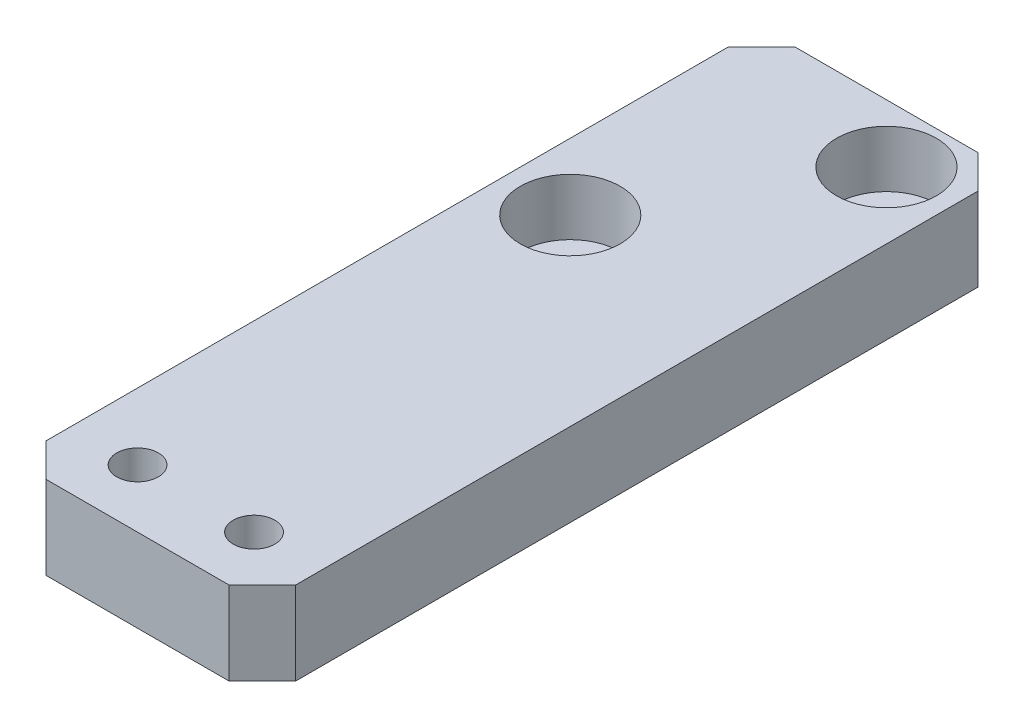
ISO-10303-21;
HEADER;
FILE_DESCRIPTION(('STEP AP214'),'2;1');
FILE_NAME('part.step','',(''),(''),'','','');
FILE_SCHEMA(('AUTOMOTIVE_DESIGN { 1 0 10303 214 1 1 1 1 }'));
ENDSEC;
DATA;
#1=APPLICATION_CONTEXT('core data for automotive mechanical design processes');
#2=APPLICATION_PROTOCOL_DEFINITION('international standard','automotive_design',2000,#1);
#3=PRODUCT_CONTEXT('',#1,'mechanical');
#4=PRODUCT('Part','Part','',(#3));
#5=PRODUCT_RELATED_PRODUCT_CATEGORY('part','',(#4));
#6=PRODUCT_DEFINITION_FORMATION('','',#4);
#7=PRODUCT_DEFINITION_CONTEXT('part definition',#1,'design');
#8=PRODUCT_DEFINITION('design','',#6,#7);
#9=PRODUCT_DEFINITION_SHAPE('','',#8);
#10=(LENGTH_UNIT() NAMED_UNIT(*) SI_UNIT(.MILLI.,.METRE.));
#11=(NAMED_UNIT(*) PLANE_ANGLE_UNIT() SI_UNIT($,.RADIAN.));
#12=(NAMED_UNIT(*) SI_UNIT($,.STERADIAN.) SOLID_ANGLE_UNIT());
#13=UNCERTAINTY_MEASURE_WITH_UNIT(LENGTH_MEASURE(1.E-05),#10,'distance_accuracy_value','');
#14=(GEOMETRIC_REPRESENTATION_CONTEXT(3) GLOBAL_UNCERTAINTY_ASSIGNED_CONTEXT((#13)) GLOBAL_UNIT_ASSIGNED_CONTEXT((#10,
#11,#12)) REPRESENTATION_CONTEXT('',''));
#15=CARTESIAN_POINT('',(0.,0.,0.));
#16=DIRECTION('',(0.,0.,1.));
#17=DIRECTION('',(1.,0.,0.));
#18=AXIS2_PLACEMENT_3D('',#15,#16,#17);
#19=CARTESIAN_POINT('',(7.5,5.,22.5));
#20=DIRECTION('',(-1.,0.,0.));
#21=DIRECTION('',(0.,0.,1.));
#22=AXIS2_PLACEMENT_3D('',#19,#20,#21);
#23=PLANE('',#22);
#24=DIRECTION('',(0.,0.,-1.));
#25=VECTOR('',#24,1.);
#26=CARTESIAN_POINT('',(7.5,0.,22.5));
#27=LINE('',#26,#25);
#28=CARTESIAN_POINT('',(7.5,0.,20.5));
#29=VERTEX_POINT('',#28);
#30=CARTESIAN_POINT('',(7.5,0.,-20.5));
#31=VERTEX_POINT('',#30);
#32=EDGE_CURVE('E145',#29,#31,#27,.T.);
#33=ORIENTED_EDGE('',*,*,#32,.T.);
#34=DIRECTION('',(0.,1.,0.));
#35=VECTOR('',#34,1.);
#36=CARTESIAN_POINT('',(7.5,5.,-20.5));
#37=LINE('',#36,#35);
#38=CARTESIAN_POINT('',(7.5,5.,-20.5));
#39=VERTEX_POINT('',#38);
#40=EDGE_CURVE('E199',#31,#39,#37,.T.);
#41=ORIENTED_EDGE('',*,*,#40,.T.);
#42=DIRECTION('',(0.,0.,-1.));
#43=VECTOR('',#42,1.);
#44=CARTESIAN_POINT('',(7.5,5.,22.5));
#45=LINE('',#44,#43);
#46=CARTESIAN_POINT('',(7.5,5.,20.5));
#47=VERTEX_POINT('',#46);
#48=EDGE_CURVE('E146',#47,#39,#45,.T.);
#49=ORIENTED_EDGE('',*,*,#48,.F.);
#50=DIRECTION('',(0.,-1.,0.));
#51=VECTOR('',#50,1.);
#52=CARTESIAN_POINT('',(7.5,0.,20.5));
#53=LINE('',#52,#51);
#54=EDGE_CURVE('E195',#47,#29,#53,.T.);
#55=ORIENTED_EDGE('',*,*,#54,.T.);
#56=EDGE_LOOP('',(#33,#41,#49,#55));
#57=FACE_BOUND('',#56,.T.);
#58=ADVANCED_FACE('F47',(#57),#23,.F.);
#59=CARTESIAN_POINT('',(7.5,5.,-22.5));
#60=DIRECTION('',(0.,0.,1.));
#61=DIRECTION('',(1.,0.,0.));
#62=AXIS2_PLACEMENT_3D('',#59,#60,#61);
#63=PLANE('',#62);
#64=DIRECTION('',(-1.,0.,0.));
#65=VECTOR('',#64,1.);
#66=CARTESIAN_POINT('',(7.5,5.,-22.5));
#67=LINE('',#66,#65);
#68=CARTESIAN_POINT('',(5.49999999999999,5.,-22.5));
#69=VERTEX_POINT('',#68);
#70=CARTESIAN_POINT('',(-5.49999999999998,5.,-22.5));
#71=VERTEX_POINT('',#70);
#72=EDGE_CURVE('E150',#69,#71,#67,.T.);
#73=ORIENTED_EDGE('',*,*,#72,.F.);
#74=DIRECTION('',(0.,-1.,0.));
#75=VECTOR('',#74,1.);
#76=CARTESIAN_POINT('',(5.49999999999999,5.,-22.5));
#77=LINE('',#76,#75);
#78=CARTESIAN_POINT('',(5.49999999999999,0.,-22.5));
#79=VERTEX_POINT('',#78);
#80=EDGE_CURVE('E179',#69,#79,#77,.T.);
#81=ORIENTED_EDGE('',*,*,#80,.T.);
#82=DIRECTION('',(-1.,0.,0.));
#83=VECTOR('',#82,1.);
#84=CARTESIAN_POINT('',(7.5,0.,-22.5));
#85=LINE('',#84,#83);
#86=CARTESIAN_POINT('',(-5.49999999999998,0.,-22.5));
#87=VERTEX_POINT('',#86);
#88=EDGE_CURVE('E166',#79,#87,#85,.T.);
#89=ORIENTED_EDGE('',*,*,#88,.T.);
#90=DIRECTION('',(0.,1.,0.));
#91=VECTOR('',#90,1.);
#92=CARTESIAN_POINT('',(-5.49999999999998,5.,-22.5));
#93=LINE('',#92,#91);
#94=EDGE_CURVE('E162',#87,#71,#93,.T.);
#95=ORIENTED_EDGE('',*,*,#94,.T.);
#96=EDGE_LOOP('',(#73,#81,#89,#95));
#97=FACE_BOUND('',#96,.T.);
#98=ADVANCED_FACE('F243',(#97),#63,.F.);
#99=CARTESIAN_POINT('',(-7.5,5.,22.5));
#100=DIRECTION('',(-1.,0.,0.));
#101=DIRECTION('',(0.,0.,1.));
#102=AXIS2_PLACEMENT_3D('',#99,#100,#101);
#103=PLANE('',#102);
#104=DIRECTION('',(0.,0.,-1.));
#105=VECTOR('',#104,1.);
#106=CARTESIAN_POINT('',(-7.5,5.,22.5));
#107=LINE('',#106,#105);
#108=CARTESIAN_POINT('',(-7.5,5.,20.5));
#109=VERTEX_POINT('',#108);
#110=CARTESIAN_POINT('',(-7.5,5.,-20.5));
#111=VERTEX_POINT('',#110);
#112=EDGE_CURVE('E155',#109,#111,#107,.T.);
#113=ORIENTED_EDGE('',*,*,#112,.T.);
#114=DIRECTION('',(0.,-1.,0.));
#115=VECTOR('',#114,1.);
#116=CARTESIAN_POINT('',(-7.5,0.,-20.5));
#117=LINE('',#116,#115);
#118=CARTESIAN_POINT('',(-7.5,0.,-20.5));
#119=VERTEX_POINT('',#118);
#120=EDGE_CURVE('E216',#111,#119,#117,.T.);
#121=ORIENTED_EDGE('',*,*,#120,.T.);
#122=DIRECTION('',(0.,0.,-1.));
#123=VECTOR('',#122,1.);
#124=CARTESIAN_POINT('',(-7.5,0.,22.5));
#125=LINE('',#124,#123);
#126=CARTESIAN_POINT('',(-7.5,0.,20.5));
#127=VERTEX_POINT('',#126);
#128=EDGE_CURVE('E170',#127,#119,#125,.T.);
#129=ORIENTED_EDGE('',*,*,#128,.F.);
#130=DIRECTION('',(0.,1.,0.));
#131=VECTOR('',#130,1.);
#132=CARTESIAN_POINT('',(-7.5,5.,20.5));
#133=LINE('',#132,#131);
#134=EDGE_CURVE('E213',#127,#109,#133,.T.);
#135=ORIENTED_EDGE('',*,*,#134,.T.);
#136=EDGE_LOOP('',(#113,#121,#129,#135));
#137=FACE_BOUND('',#136,.T.);
#138=ADVANCED_FACE('F250',(#137),#103,.T.);
#139=CARTESIAN_POINT('',(7.5,5.,22.5));
#140=DIRECTION('',(0.,0.,1.));
#141=DIRECTION('',(1.,0.,0.));
#142=AXIS2_PLACEMENT_3D('',#139,#140,#141);
#143=PLANE('',#142);
#144=DIRECTION('',(-1.,0.,0.));
#145=VECTOR('',#144,1.);
#146=CARTESIAN_POINT('',(7.5,0.,22.5));
#147=LINE('',#146,#145);
#148=CARTESIAN_POINT('',(5.5,0.,22.5));
#149=VERTEX_POINT('',#148);
#150=CARTESIAN_POINT('',(-5.5,0.,22.5));
#151=VERTEX_POINT('',#150);
#152=EDGE_CURVE('E151',#149,#151,#147,.T.);
#153=ORIENTED_EDGE('',*,*,#152,.F.);
#154=DIRECTION('',(0.,1.,0.));
#155=VECTOR('',#154,1.);
#156=CARTESIAN_POINT('',(5.5,5.,22.5));
#157=LINE('',#156,#155);
#158=CARTESIAN_POINT('',(5.5,5.,22.5));
#159=VERTEX_POINT('',#158);
#160=EDGE_CURVE('E11',#149,#159,#157,.T.);
#161=ORIENTED_EDGE('',*,*,#160,.T.);
#162=DIRECTION('',(-1.,0.,0.));
#163=VECTOR('',#162,1.);
#164=CARTESIAN_POINT('',(7.5,5.,22.5));
#165=LINE('',#164,#163);
#166=CARTESIAN_POINT('',(-5.5,5.,22.5));
#167=VERTEX_POINT('',#166);
#168=EDGE_CURVE('E159',#159,#167,#165,.T.);
#169=ORIENTED_EDGE('',*,*,#168,.T.);
#170=DIRECTION('',(0.,-1.,0.));
#171=VECTOR('',#170,1.);
#172=CARTESIAN_POINT('',(-5.5,5.,22.5));
#173=LINE('',#172,#171);
#174=EDGE_CURVE('E57',#167,#151,#173,.T.);
#175=ORIENTED_EDGE('',*,*,#174,.T.);
#176=EDGE_LOOP('',(#153,#161,#169,#175));
#177=FACE_BOUND('',#176,.T.);
#178=ADVANCED_FACE('F222',(#177),#143,.T.);
#179=CARTESIAN_POINT('',(0.,5.,0.));
#180=DIRECTION('',(0.,1.,0.));
#181=DIRECTION('',(0.,0.,1.));
#182=AXIS2_PLACEMENT_3D('',#179,#180,#181);
#183=PLANE('',#182);
#184=CARTESIAN_POINT('',(3.5,5.,-19.));
#185=DIRECTION('',(0.,1.,0.));
#186=DIRECTION('',(0.,0.,1.));
#187=AXIS2_PLACEMENT_3D('',#184,#185,#186);
#188=CIRCLE('',#187,3.);
#189=CARTESIAN_POINT('',(3.5,5.,-16.));
#190=VERTEX_POINT('',#189);
#191=EDGE_CURVE('E499',#190,#190,#188,.T.);
#192=ORIENTED_EDGE('',*,*,#191,.F.);
#193=EDGE_LOOP('',(#192));
#194=FACE_BOUND('',#193,.T.);
#195=CARTESIAN_POINT('',(-3.5,5.,-7.));
#196=DIRECTION('',(0.,1.,0.));
#197=DIRECTION('',(0.,0.,1.));
#198=AXIS2_PLACEMENT_3D('',#195,#196,#197);
#199=CIRCLE('',#198,3.);
#200=CARTESIAN_POINT('',(-3.5,5.,-4.));
#201=VERTEX_POINT('',#200);
#202=EDGE_CURVE('E503',#201,#201,#199,.T.);
#203=ORIENTED_EDGE('',*,*,#202,.F.);
#204=EDGE_LOOP('',(#203));
#205=FACE_BOUND('',#204,.T.);
#206=CARTESIAN_POINT('',(-3.5,5.,19.));
#207=DIRECTION('',(0.,1.,0.));
#208=DIRECTION('',(0.,0.,1.));
#209=AXIS2_PLACEMENT_3D('',#206,#207,#208);
#210=CIRCLE('',#209,1.24999999999999);
#211=CARTESIAN_POINT('',(-3.5,5.,20.25));
#212=VERTEX_POINT('',#211);
#213=EDGE_CURVE('E130',#212,#212,#210,.T.);
#214=ORIENTED_EDGE('',*,*,#213,.F.);
#215=EDGE_LOOP('',(#214));
#216=FACE_BOUND('',#215,.T.);
#217=CARTESIAN_POINT('',(3.5,5.,19.));
#218=DIRECTION('',(0.,1.,0.));
#219=DIRECTION('',(0.,0.,1.));
#220=AXIS2_PLACEMENT_3D('',#217,#218,#219);
#221=CIRCLE('',#220,1.24999999999999);
#222=CARTESIAN_POINT('',(3.5,5.,20.25));
#223=VERTEX_POINT('',#222);
#224=EDGE_CURVE('E129',#223,#223,#221,.T.);
#225=ORIENTED_EDGE('',*,*,#224,.F.);
#226=EDGE_LOOP('',(#225));
#227=FACE_BOUND('',#226,.T.);
#228=ORIENTED_EDGE('',*,*,#48,.T.);
#229=DIRECTION('',(0.707106781186548,0.,0.707106781186547));
#230=VECTOR('',#229,1.);
#231=CARTESIAN_POINT('',(14.,5.,-14.));
#232=LINE('',#231,#230);
#233=EDGE_CURVE('E210',#39,#69,#232,.F.);
#234=ORIENTED_EDGE('',*,*,#233,.T.);
#235=ORIENTED_EDGE('',*,*,#72,.T.);
#236=DIRECTION('',(-0.70710678118655,0.,0.707106781186545));
#237=VECTOR('',#236,1.);
#238=CARTESIAN_POINT('',(-14.,5.,-14.0000000000001));
#239=LINE('',#238,#237);
#240=EDGE_CURVE('E207',#71,#111,#239,.T.);
#241=ORIENTED_EDGE('',*,*,#240,.T.);
#242=ORIENTED_EDGE('',*,*,#112,.F.);
#243=DIRECTION('',(-0.707106781186546,0.,-0.707106781186549));
#244=VECTOR('',#243,1.);
#245=CARTESIAN_POINT('',(-14.,5.,14.));
#246=LINE('',#245,#244);
#247=EDGE_CURVE('E64',#109,#167,#246,.F.);
#248=ORIENTED_EDGE('',*,*,#247,.T.);
#249=ORIENTED_EDGE('',*,*,#168,.F.);
#250=DIRECTION('',(0.707106781186549,0.,-0.707106781186546));
#251=VECTOR('',#250,1.);
#252=CARTESIAN_POINT('',(14.,5.,14.));
#253=LINE('',#252,#251);
#254=EDGE_CURVE('E204',#159,#47,#253,.T.);
#255=ORIENTED_EDGE('',*,*,#254,.T.);
#256=EDGE_LOOP('',(#228,#234,#235,#241,#242,#248,#249,#255));
#257=FACE_BOUND('',#256,.T.);
#258=ADVANCED_FACE('F237',(#194,#205,#216,#227,#257),#183,.T.);
#259=CARTESIAN_POINT('',(0.,0.,0.));
#260=DIRECTION('',(0.,1.,0.));
#261=DIRECTION('',(0.,0.,1.));
#262=AXIS2_PLACEMENT_3D('',#259,#260,#261);
#263=PLANE('',#262);
#264=CARTESIAN_POINT('',(3.5,0.,-19.));
#265=DIRECTION('',(0.,1.,0.));
#266=DIRECTION('',(0.,0.,1.));
#267=AXIS2_PLACEMENT_3D('',#264,#265,#266);
#268=CIRCLE('',#267,1.7);
#269=CARTESIAN_POINT('',(3.5,0.,-17.3));
#270=VERTEX_POINT('',#269);
#271=EDGE_CURVE('E512',#270,#270,#268,.T.);
#272=ORIENTED_EDGE('',*,*,#271,.T.);
#273=EDGE_LOOP('',(#272));
#274=FACE_BOUND('',#273,.T.);
#275=CARTESIAN_POINT('',(-3.5,0.,-7.));
#276=DIRECTION('',(0.,1.,0.));
#277=DIRECTION('',(0.,0.,1.));
#278=AXIS2_PLACEMENT_3D('',#275,#276,#277);
#279=CIRCLE('',#278,1.7);
#280=CARTESIAN_POINT('',(-3.5,0.,-5.3));
#281=VERTEX_POINT('',#280);
#282=EDGE_CURVE('E138',#281,#281,#279,.T.);
#283=ORIENTED_EDGE('',*,*,#282,.T.);
#284=EDGE_LOOP('',(#283));
#285=FACE_BOUND('',#284,.T.);
#286=ORIENTED_EDGE('',*,*,#88,.F.);
#287=DIRECTION('',(-0.707106781186548,0.,-0.707106781186547));
#288=VECTOR('',#287,1.);
#289=CARTESIAN_POINT('',(5.49999999999999,0.,-22.5));
#290=LINE('',#289,#288);
#291=EDGE_CURVE('E192',#79,#31,#290,.F.);
#292=ORIENTED_EDGE('',*,*,#291,.T.);
#293=ORIENTED_EDGE('',*,*,#32,.F.);
#294=DIRECTION('',(-0.707106781186549,0.,0.707106781186546));
#295=VECTOR('',#294,1.);
#296=CARTESIAN_POINT('',(7.5,0.,20.5));
#297=LINE('',#296,#295);
#298=EDGE_CURVE('E186',#29,#149,#297,.T.);
#299=ORIENTED_EDGE('',*,*,#298,.T.);
#300=ORIENTED_EDGE('',*,*,#152,.T.);
#301=DIRECTION('',(0.707106781186546,0.,0.707106781186549));
#302=VECTOR('',#301,1.);
#303=CARTESIAN_POINT('',(-5.5,0.,22.5));
#304=LINE('',#303,#302);
#305=EDGE_CURVE('E183',#151,#127,#304,.F.);
#306=ORIENTED_EDGE('',*,*,#305,.T.);
#307=ORIENTED_EDGE('',*,*,#128,.T.);
#308=DIRECTION('',(0.70710678118655,0.,-0.707106781186545));
#309=VECTOR('',#308,1.);
#310=CARTESIAN_POINT('',(-7.5,0.,-20.5));
#311=LINE('',#310,#309);
#312=EDGE_CURVE('E189',#119,#87,#311,.T.);
#313=ORIENTED_EDGE('',*,*,#312,.T.);
#314=EDGE_LOOP('',(#286,#292,#293,#299,#300,#306,#307,#313));
#315=FACE_BOUND('',#314,.T.);
#316=ADVANCED_FACE('F226',(#274,#285,#315),#263,.F.);
#317=CARTESIAN_POINT('',(3.5,1.,19.));
#318=DIRECTION('',(0.,1.,0.));
#319=DIRECTION('',(0.,0.,1.));
#320=AXIS2_PLACEMENT_3D('',#317,#318,#319);
#321=CONICAL_SURFACE('',#320,1.25,1.02974425867665);
#322=CARTESIAN_POINT('',(3.5,0.24892422621555,19.));
#323=VERTEX_POINT('',#322);
#324=VERTEX_LOOP('',#323);
#325=FACE_BOUND('',#324,.T.);
#326=CARTESIAN_POINT('',(3.5,1.,19.));
#327=DIRECTION('',(0.,1.,0.));
#328=DIRECTION('',(0.,0.,1.));
#329=AXIS2_PLACEMENT_3D('',#326,#327,#328);
#330=CIRCLE('',#329,1.25);
#331=CARTESIAN_POINT('',(3.5,1.,20.25));
#332=VERTEX_POINT('',#331);
#333=EDGE_CURVE('E135',#332,#332,#330,.T.);
#334=ORIENTED_EDGE('',*,*,#333,.T.);
#335=EDGE_LOOP('',(#334));
#336=FACE_BOUND('',#335,.T.);
#337=ADVANCED_FACE('F386',(#325,#336),#321,.F.);
#338=CARTESIAN_POINT('',(3.5,5.,19.));
#339=DIRECTION('',(0.,1.,0.));
#340=DIRECTION('',(0.,0.,1.));
#341=AXIS2_PLACEMENT_3D('',#338,#339,#340);
#342=CYLINDRICAL_SURFACE('',#341,1.24999999999999);
#343=ORIENTED_EDGE('',*,*,#333,.F.);
#344=EDGE_LOOP('',(#343));
#345=FACE_BOUND('',#344,.T.);
#346=ORIENTED_EDGE('',*,*,#224,.T.);
#347=EDGE_LOOP('',(#346));
#348=FACE_BOUND('',#347,.T.);
#349=ADVANCED_FACE('F122',(#345,#348),#342,.F.);
#350=CARTESIAN_POINT('',(-3.5,1.,19.));
#351=DIRECTION('',(0.,1.,0.));
#352=DIRECTION('',(0.,0.,1.));
#353=AXIS2_PLACEMENT_3D('',#350,#351,#352);
#354=CONICAL_SURFACE('',#353,1.25,1.02974425867665);
#355=CARTESIAN_POINT('',(-3.5,0.24892422621555,19.));
#356=VERTEX_POINT('',#355);
#357=VERTEX_LOOP('',#356);
#358=FACE_BOUND('',#357,.T.);
#359=CARTESIAN_POINT('',(-3.5,1.,19.));
#360=DIRECTION('',(0.,1.,0.));
#361=DIRECTION('',(0.,0.,1.));
#362=AXIS2_PLACEMENT_3D('',#359,#360,#361);
#363=CIRCLE('',#362,1.25);
#364=CARTESIAN_POINT('',(-3.5,1.,20.25));
#365=VERTEX_POINT('',#364);
#366=EDGE_CURVE('E126',#365,#365,#363,.T.);
#367=ORIENTED_EDGE('',*,*,#366,.T.);
#368=EDGE_LOOP('',(#367));
#369=FACE_BOUND('',#368,.T.);
#370=ADVANCED_FACE('F118',(#358,#369),#354,.F.);
#371=CARTESIAN_POINT('',(-3.5,5.,19.));
#372=DIRECTION('',(0.,1.,0.));
#373=DIRECTION('',(0.,0.,1.));
#374=AXIS2_PLACEMENT_3D('',#371,#372,#373);
#375=CYLINDRICAL_SURFACE('',#374,1.24999999999999);
#376=ORIENTED_EDGE('',*,*,#366,.F.);
#377=EDGE_LOOP('',(#376));
#378=FACE_BOUND('',#377,.T.);
#379=ORIENTED_EDGE('',*,*,#213,.T.);
#380=EDGE_LOOP('',(#379));
#381=FACE_BOUND('',#380,.T.);
#382=ADVANCED_FACE('F121',(#378,#381),#375,.F.);
#383=CARTESIAN_POINT('',(-3.5,5.,-7.));
#384=DIRECTION('',(0.,1.,0.));
#385=DIRECTION('',(0.,0.,1.));
#386=AXIS2_PLACEMENT_3D('',#383,#384,#385);
#387=CYLINDRICAL_SURFACE('',#386,1.7);
#388=ORIENTED_EDGE('',*,*,#282,.F.);
#389=EDGE_LOOP('',(#388));
#390=FACE_BOUND('',#389,.T.);
#391=CARTESIAN_POINT('',(-3.5,1.6,-7.));
#392=DIRECTION('',(0.,1.,0.));
#393=DIRECTION('',(0.,0.,1.));
#394=AXIS2_PLACEMENT_3D('',#391,#392,#393);
#395=CIRCLE('',#394,1.7);
#396=CARTESIAN_POINT('',(-3.5,1.6,-5.3));
#397=VERTEX_POINT('',#396);
#398=EDGE_CURVE('E517',#397,#397,#395,.T.);
#399=ORIENTED_EDGE('',*,*,#398,.T.);
#400=EDGE_LOOP('',(#399));
#401=FACE_BOUND('',#400,.T.);
#402=ADVANCED_FACE('F353',(#390,#401),#387,.F.);
#403=CARTESIAN_POINT('',(-1.8,1.6,-7.));
#404=DIRECTION('',(0.,-1.,0.));
#405=DIRECTION('',(0.,0.,-1.));
#406=AXIS2_PLACEMENT_3D('',#403,#404,#405);
#407=PLANE('',#406);
#408=ORIENTED_EDGE('',*,*,#398,.F.);
#409=EDGE_LOOP('',(#408));
#410=FACE_BOUND('',#409,.T.);
#411=CARTESIAN_POINT('',(-3.5,1.6,-7.));
#412=DIRECTION('',(0.,1.,0.));
#413=DIRECTION('',(0.,0.,1.));
#414=AXIS2_PLACEMENT_3D('',#411,#412,#413);
#415=CIRCLE('',#414,3.);
#416=CARTESIAN_POINT('',(-3.5,1.6,-4.));
#417=VERTEX_POINT('',#416);
#418=EDGE_CURVE('E511',#417,#417,#415,.T.);
#419=ORIENTED_EDGE('',*,*,#418,.T.);
#420=EDGE_LOOP('',(#419));
#421=FACE_BOUND('',#420,.T.);
#422=ADVANCED_FACE('F343',(#410,#421),#407,.F.);
#423=CARTESIAN_POINT('',(-3.5,5.,-7.));
#424=DIRECTION('',(0.,1.,0.));
#425=DIRECTION('',(0.,0.,1.));
#426=AXIS2_PLACEMENT_3D('',#423,#424,#425);
#427=CYLINDRICAL_SURFACE('',#426,3.);
#428=ORIENTED_EDGE('',*,*,#418,.F.);
#429=EDGE_LOOP('',(#428));
#430=FACE_BOUND('',#429,.T.);
#431=ORIENTED_EDGE('',*,*,#202,.T.);
#432=EDGE_LOOP('',(#431));
#433=FACE_BOUND('',#432,.T.);
#434=ADVANCED_FACE('F333',(#430,#433),#427,.F.);
#435=CARTESIAN_POINT('',(3.5,5.,-19.));
#436=DIRECTION('',(0.,1.,0.));
#437=DIRECTION('',(0.,0.,1.));
#438=AXIS2_PLACEMENT_3D('',#435,#436,#437);
#439=CYLINDRICAL_SURFACE('',#438,1.7);
#440=ORIENTED_EDGE('',*,*,#271,.F.);
#441=EDGE_LOOP('',(#440));
#442=FACE_BOUND('',#441,.T.);
#443=CARTESIAN_POINT('',(3.5,1.6,-19.));
#444=DIRECTION('',(0.,1.,0.));
#445=DIRECTION('',(0.,0.,1.));
#446=AXIS2_PLACEMENT_3D('',#443,#444,#445);
#447=CIRCLE('',#446,1.7);
#448=CARTESIAN_POINT('',(3.5,1.6,-17.3));
#449=VERTEX_POINT('',#448);
#450=EDGE_CURVE('E520',#449,#449,#447,.T.);
#451=ORIENTED_EDGE('',*,*,#450,.T.);
#452=EDGE_LOOP('',(#451));
#453=FACE_BOUND('',#452,.T.);
#454=ADVANCED_FACE('F323',(#442,#453),#439,.F.);
#455=CARTESIAN_POINT('',(5.2,1.6,-19.));
#456=DIRECTION('',(0.,-1.,0.));
#457=DIRECTION('',(0.,0.,-1.));
#458=AXIS2_PLACEMENT_3D('',#455,#456,#457);
#459=PLANE('',#458);
#460=ORIENTED_EDGE('',*,*,#450,.F.);
#461=EDGE_LOOP('',(#460));
#462=FACE_BOUND('',#461,.T.);
#463=CARTESIAN_POINT('',(3.5,1.6,-19.));
#464=DIRECTION('',(0.,1.,0.));
#465=DIRECTION('',(0.,0.,1.));
#466=AXIS2_PLACEMENT_3D('',#463,#464,#465);
#467=CIRCLE('',#466,3.);
#468=CARTESIAN_POINT('',(3.5,1.6,-16.));
#469=VERTEX_POINT('',#468);
#470=EDGE_CURVE('E537',#469,#469,#467,.T.);
#471=ORIENTED_EDGE('',*,*,#470,.T.);
#472=EDGE_LOOP('',(#471));
#473=FACE_BOUND('',#472,.T.);
#474=ADVANCED_FACE('F313',(#462,#473),#459,.F.);
#475=CARTESIAN_POINT('',(3.5,5.,-19.));
#476=DIRECTION('',(0.,1.,0.));
#477=DIRECTION('',(0.,0.,1.));
#478=AXIS2_PLACEMENT_3D('',#475,#476,#477);
#479=CYLINDRICAL_SURFACE('',#478,3.);
#480=ORIENTED_EDGE('',*,*,#470,.F.);
#481=EDGE_LOOP('',(#480));
#482=FACE_BOUND('',#481,.T.);
#483=ORIENTED_EDGE('',*,*,#191,.T.);
#484=EDGE_LOOP('',(#483));
#485=FACE_BOUND('',#484,.T.);
#486=ADVANCED_FACE('F270',(#482,#485),#479,.F.);
#487=CARTESIAN_POINT('',(5.49999999999999,5.,-22.5));
#488=DIRECTION('',(-0.707106781186547,0.,0.707106781186548));
#489=DIRECTION('',(0.,-1.,0.));
#490=AXIS2_PLACEMENT_3D('',#487,#488,#489);
#491=PLANE('',#490);
#492=ORIENTED_EDGE('',*,*,#233,.F.);
#493=ORIENTED_EDGE('',*,*,#40,.F.);
#494=ORIENTED_EDGE('',*,*,#291,.F.);
#495=ORIENTED_EDGE('',*,*,#80,.F.);
#496=EDGE_LOOP('',(#492,#493,#494,#495));
#497=FACE_BOUND('',#496,.T.);
#498=ADVANCED_FACE('F241',(#497),#491,.F.);
#499=CARTESIAN_POINT('',(-7.5,5.,-20.5));
#500=DIRECTION('',(-0.707106781186545,0.,-0.70710678118655));
#501=DIRECTION('',(0.,1.,0.));
#502=AXIS2_PLACEMENT_3D('',#499,#500,#501);
#503=PLANE('',#502);
#504=ORIENTED_EDGE('',*,*,#240,.F.);
#505=ORIENTED_EDGE('',*,*,#94,.F.);
#506=ORIENTED_EDGE('',*,*,#312,.F.);
#507=ORIENTED_EDGE('',*,*,#120,.F.);
#508=EDGE_LOOP('',(#504,#505,#506,#507));
#509=FACE_BOUND('',#508,.T.);
#510=ADVANCED_FACE('F248',(#509),#503,.T.);
#511=CARTESIAN_POINT('',(7.5,5.,20.5));
#512=DIRECTION('',(0.707106781186546,0.,0.707106781186549));
#513=DIRECTION('',(0.,1.,0.));
#514=AXIS2_PLACEMENT_3D('',#511,#512,#513);
#515=PLANE('',#514);
#516=ORIENTED_EDGE('',*,*,#254,.F.);
#517=ORIENTED_EDGE('',*,*,#160,.F.);
#518=ORIENTED_EDGE('',*,*,#298,.F.);
#519=ORIENTED_EDGE('',*,*,#54,.F.);
#520=EDGE_LOOP('',(#516,#517,#518,#519));
#521=FACE_BOUND('',#520,.T.);
#522=ADVANCED_FACE('F232',(#521),#515,.T.);
#523=CARTESIAN_POINT('',(-5.5,5.,22.5));
#524=DIRECTION('',(0.707106781186549,0.,-0.707106781186546));
#525=DIRECTION('',(0.,-1.,0.));
#526=AXIS2_PLACEMENT_3D('',#523,#524,#525);
#527=PLANE('',#526);
#528=ORIENTED_EDGE('',*,*,#247,.F.);
#529=ORIENTED_EDGE('',*,*,#134,.F.);
#530=ORIENTED_EDGE('',*,*,#305,.F.);
#531=ORIENTED_EDGE('',*,*,#174,.F.);
#532=EDGE_LOOP('',(#528,#529,#530,#531));
#533=FACE_BOUND('',#532,.T.);
#534=ADVANCED_FACE('F50',(#533),#527,.F.);
#535=CLOSED_SHELL('',(#58,#98,#138,#178,#258,#316,#337,#349,#370,#382,#402,#422,#434,#454,#474,
#486,#498,#510,#522,#534));
#536=MANIFOLD_SOLID_BREP('B2',#535);
#537=ADVANCED_BREP_SHAPE_REPRESENTATION('',(#18,#536),#14);
#538=SHAPE_DEFINITION_REPRESENTATION(#9,#537);
ENDSEC;
END-ISO-10303-21;
